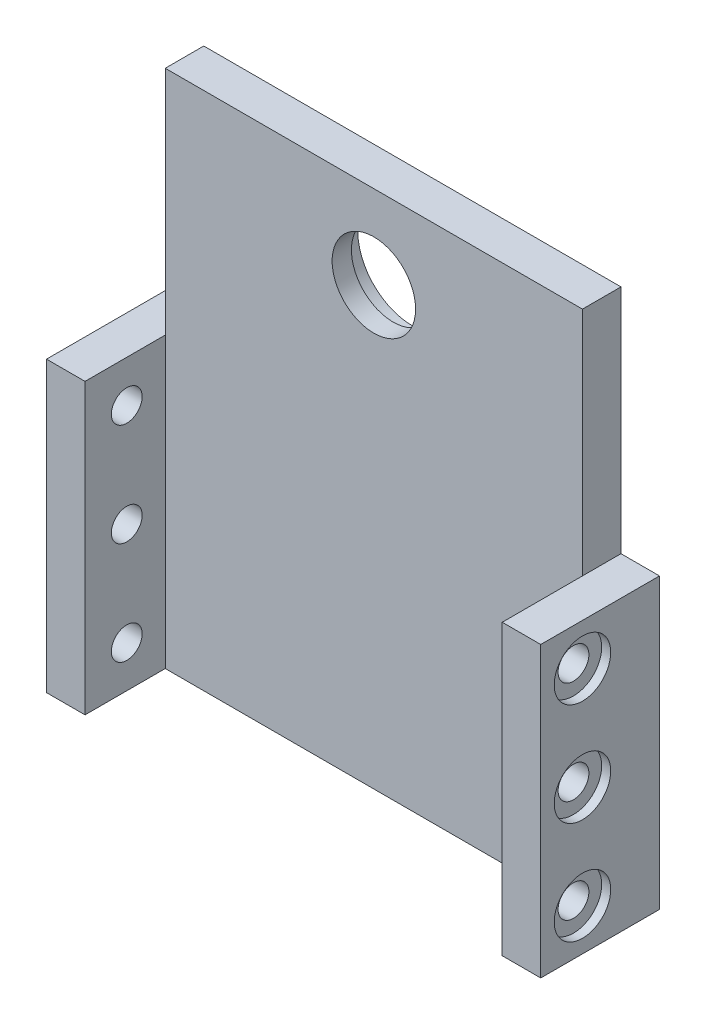
ISO-10303-21;
HEADER;
FILE_DESCRIPTION(('STEP AP214'),'2;1');
FILE_NAME('part.step','',(''),(''),'','','');
FILE_SCHEMA(('AUTOMOTIVE_DESIGN { 1 0 10303 214 1 1 1 1 }'));
ENDSEC;
DATA;
#1=APPLICATION_CONTEXT('core data for automotive mechanical design processes');
#2=APPLICATION_PROTOCOL_DEFINITION('international standard','automotive_design',2000,#1);
#3=PRODUCT_CONTEXT('',#1,'mechanical');
#4=PRODUCT('Part','Part','',(#3));
#5=PRODUCT_RELATED_PRODUCT_CATEGORY('part','',(#4));
#6=PRODUCT_DEFINITION_FORMATION('','',#4);
#7=PRODUCT_DEFINITION_CONTEXT('part definition',#1,'design');
#8=PRODUCT_DEFINITION('design','',#6,#7);
#9=PRODUCT_DEFINITION_SHAPE('','',#8);
#10=(LENGTH_UNIT() NAMED_UNIT(*) SI_UNIT(.MILLI.,.METRE.));
#11=(NAMED_UNIT(*) PLANE_ANGLE_UNIT() SI_UNIT($,.RADIAN.));
#12=(NAMED_UNIT(*) SI_UNIT($,.STERADIAN.) SOLID_ANGLE_UNIT());
#13=UNCERTAINTY_MEASURE_WITH_UNIT(LENGTH_MEASURE(1.E-05),#10,'distance_accuracy_value','');
#14=(GEOMETRIC_REPRESENTATION_CONTEXT(3) GLOBAL_UNCERTAINTY_ASSIGNED_CONTEXT((#13)) GLOBAL_UNIT_ASSIGNED_CONTEXT((#10,
#11,#12)) REPRESENTATION_CONTEXT('',''));
#15=CARTESIAN_POINT('',(0.,0.,0.));
#16=DIRECTION('',(0.,0.,1.));
#17=DIRECTION('',(1.,0.,0.));
#18=AXIS2_PLACEMENT_3D('',#15,#16,#17);
#19=CARTESIAN_POINT('',(16.25,-11.25,-3.));
#20=DIRECTION('',(1.,0.,0.));
#21=DIRECTION('',(0.,0.,-1.));
#22=AXIS2_PLACEMENT_3D('',#19,#20,#21);
#23=PLANE('',#22);
#24=DIRECTION('',(0.,1.,0.));
#25=VECTOR('',#24,1.);
#26=CARTESIAN_POINT('',(16.25,-11.25,0.));
#27=LINE('',#26,#25);
#28=CARTESIAN_POINT('',(16.25,11.25,0.));
#29=VERTEX_POINT('',#28);
#30=CARTESIAN_POINT('',(16.25,29.25,0.));
#31=VERTEX_POINT('',#30);
#32=EDGE_CURVE('E184',#29,#31,#27,.T.);
#33=ORIENTED_EDGE('',*,*,#32,.F.);
#34=DIRECTION('',(0.,0.,-1.));
#35=VECTOR('',#34,1.);
#36=CARTESIAN_POINT('',(16.25,11.25,-3.));
#37=LINE('',#36,#35);
#38=CARTESIAN_POINT('',(16.25,11.25,-3.));
#39=VERTEX_POINT('',#38);
#40=EDGE_CURVE('E12',#29,#39,#37,.T.);
#41=ORIENTED_EDGE('',*,*,#40,.T.);
#42=DIRECTION('',(0.,1.,0.));
#43=VECTOR('',#42,1.);
#44=CARTESIAN_POINT('',(16.25,-11.25,-3.));
#45=LINE('',#44,#43);
#46=CARTESIAN_POINT('',(16.25,29.25,-3.));
#47=VERTEX_POINT('',#46);
#48=EDGE_CURVE('E128',#39,#47,#45,.T.);
#49=ORIENTED_EDGE('',*,*,#48,.T.);
#50=DIRECTION('',(0.,0.,1.));
#51=VECTOR('',#50,1.);
#52=CARTESIAN_POINT('',(16.25,29.25,-3.));
#53=LINE('',#52,#51);
#54=EDGE_CURVE('E194',#47,#31,#53,.T.);
#55=ORIENTED_EDGE('',*,*,#54,.T.);
#56=EDGE_LOOP('',(#33,#41,#49,#55));
#57=FACE_BOUND('',#56,.T.);
#58=ADVANCED_FACE('F39',(#57),#23,.T.);
#59=CARTESIAN_POINT('',(16.25,-11.25,-3.));
#60=DIRECTION('',(0.,-1.,0.));
#61=DIRECTION('',(1.,0.,0.));
#62=AXIS2_PLACEMENT_3D('',#59,#60,#61);
#63=PLANE('',#62);
#64=DIRECTION('',(1.,0.,0.));
#65=VECTOR('',#64,1.);
#66=CARTESIAN_POINT('',(16.25,-11.25,0.));
#67=LINE('',#66,#65);
#68=CARTESIAN_POINT('',(-16.25,-11.25,0.));
#69=VERTEX_POINT('',#68);
#70=CARTESIAN_POINT('',(16.25,-11.25,0.));
#71=VERTEX_POINT('',#70);
#72=EDGE_CURVE('E187',#69,#71,#67,.T.);
#73=ORIENTED_EDGE('',*,*,#72,.F.);
#74=DIRECTION('',(0.,0.,1.));
#75=VECTOR('',#74,1.);
#76=CARTESIAN_POINT('',(-16.25,-11.25,-3.));
#77=LINE('',#76,#75);
#78=CARTESIAN_POINT('',(-16.25,-11.25,6.25000000000003));
#79=VERTEX_POINT('',#78);
#80=EDGE_CURVE('E129',#69,#79,#77,.T.);
#81=ORIENTED_EDGE('',*,*,#80,.T.);
#82=DIRECTION('',(1.,0.,0.));
#83=VECTOR('',#82,1.);
#84=CARTESIAN_POINT('',(-19.25,-11.25,6.25000000000003));
#85=LINE('',#84,#83);
#86=CARTESIAN_POINT('',(-19.25,-11.25,6.25000000000003));
#87=VERTEX_POINT('',#86);
#88=EDGE_CURVE('E181',#87,#79,#85,.T.);
#89=ORIENTED_EDGE('',*,*,#88,.F.);
#90=DIRECTION('',(0.,0.,1.));
#91=VECTOR('',#90,1.);
#92=CARTESIAN_POINT('',(-19.25,-11.25,-3.));
#93=LINE('',#92,#91);
#94=CARTESIAN_POINT('',(-19.25,-11.25,-3.));
#95=VERTEX_POINT('',#94);
#96=EDGE_CURVE('E163',#95,#87,#93,.T.);
#97=ORIENTED_EDGE('',*,*,#96,.F.);
#98=DIRECTION('',(1.,0.,0.));
#99=VECTOR('',#98,1.);
#100=CARTESIAN_POINT('',(16.25,-11.25,-3.));
#101=LINE('',#100,#99);
#102=CARTESIAN_POINT('',(19.25,-11.25,-3.));
#103=VERTEX_POINT('',#102);
#104=EDGE_CURVE('E192',#95,#103,#101,.T.);
#105=ORIENTED_EDGE('',*,*,#104,.T.);
#106=DIRECTION('',(0.,0.,1.));
#107=VECTOR('',#106,1.);
#108=CARTESIAN_POINT('',(19.25,-11.25,-3.));
#109=LINE('',#108,#107);
#110=CARTESIAN_POINT('',(19.25,-11.25,6.25000000000003));
#111=VERTEX_POINT('',#110);
#112=EDGE_CURVE('E139',#103,#111,#109,.T.);
#113=ORIENTED_EDGE('',*,*,#112,.T.);
#114=DIRECTION('',(-1.,0.,0.));
#115=VECTOR('',#114,1.);
#116=CARTESIAN_POINT('',(19.25,-11.25,6.25000000000003));
#117=LINE('',#116,#115);
#118=CARTESIAN_POINT('',(16.25,-11.25,6.25000000000003));
#119=VERTEX_POINT('',#118);
#120=EDGE_CURVE('E149',#111,#119,#117,.T.);
#121=ORIENTED_EDGE('',*,*,#120,.T.);
#122=DIRECTION('',(0.,0.,1.));
#123=VECTOR('',#122,1.);
#124=CARTESIAN_POINT('',(16.25,-11.25,-3.));
#125=LINE('',#124,#123);
#126=EDGE_CURVE('E140',#71,#119,#125,.T.);
#127=ORIENTED_EDGE('',*,*,#126,.F.);
#128=EDGE_LOOP('',(#73,#81,#89,#97,#105,#113,#121,#127));
#129=FACE_BOUND('',#128,.T.);
#130=ADVANCED_FACE('F222',(#129),#63,.T.);
#131=CARTESIAN_POINT('',(-16.25,-11.25,-3.));
#132=DIRECTION('',(-1.,0.,0.));
#133=DIRECTION('',(0.,0.,1.));
#134=AXIS2_PLACEMENT_3D('',#131,#132,#133);
#135=PLANE('',#134);
#136=DIRECTION('',(0.,0.,-1.));
#137=VECTOR('',#136,1.);
#138=CARTESIAN_POINT('',(-16.25,11.25,-3.));
#139=LINE('',#138,#137);
#140=CARTESIAN_POINT('',(-16.25,11.25,0.));
#141=VERTEX_POINT('',#140);
#142=CARTESIAN_POINT('',(-16.25,11.25,-3.));
#143=VERTEX_POINT('',#142);
#144=EDGE_CURVE('E47',#141,#143,#139,.T.);
#145=ORIENTED_EDGE('',*,*,#144,.F.);
#146=DIRECTION('',(0.,-1.,0.));
#147=VECTOR('',#146,1.);
#148=CARTESIAN_POINT('',(-16.25,-11.25,0.));
#149=LINE('',#148,#147);
#150=CARTESIAN_POINT('',(-16.25,29.25,0.));
#151=VERTEX_POINT('',#150);
#152=EDGE_CURVE('E202',#151,#141,#149,.T.);
#153=ORIENTED_EDGE('',*,*,#152,.F.);
#154=DIRECTION('',(0.,0.,1.));
#155=VECTOR('',#154,1.);
#156=CARTESIAN_POINT('',(-16.25,29.25,-3.));
#157=LINE('',#156,#155);
#158=CARTESIAN_POINT('',(-16.25,29.25,-3.));
#159=VERTEX_POINT('',#158);
#160=EDGE_CURVE('E206',#159,#151,#157,.T.);
#161=ORIENTED_EDGE('',*,*,#160,.F.);
#162=DIRECTION('',(0.,-1.,0.));
#163=VECTOR('',#162,1.);
#164=CARTESIAN_POINT('',(-16.25,-11.25,-3.));
#165=LINE('',#164,#163);
#166=EDGE_CURVE('E190',#159,#143,#165,.T.);
#167=ORIENTED_EDGE('',*,*,#166,.T.);
#168=EDGE_LOOP('',(#145,#153,#161,#167));
#169=FACE_BOUND('',#168,.T.);
#170=ADVANCED_FACE('F242',(#169),#135,.T.);
#171=CARTESIAN_POINT('',(16.25,29.25,-3.));
#172=DIRECTION('',(0.,1.,0.));
#173=DIRECTION('',(-1.,0.,0.));
#174=AXIS2_PLACEMENT_3D('',#171,#172,#173);
#175=PLANE('',#174);
#176=DIRECTION('',(-1.,0.,0.));
#177=VECTOR('',#176,1.);
#178=CARTESIAN_POINT('',(16.25,29.25,0.));
#179=LINE('',#178,#177);
#180=EDGE_CURVE('E198',#31,#151,#179,.T.);
#181=ORIENTED_EDGE('',*,*,#180,.F.);
#182=ORIENTED_EDGE('',*,*,#54,.F.);
#183=DIRECTION('',(-1.,0.,0.));
#184=VECTOR('',#183,1.);
#185=CARTESIAN_POINT('',(16.25,29.25,-3.));
#186=LINE('',#185,#184);
#187=EDGE_CURVE('E186',#47,#159,#186,.T.);
#188=ORIENTED_EDGE('',*,*,#187,.T.);
#189=ORIENTED_EDGE('',*,*,#160,.T.);
#190=EDGE_LOOP('',(#181,#182,#188,#189));
#191=FACE_BOUND('',#190,.T.);
#192=ADVANCED_FACE('F213',(#191),#175,.T.);
#193=CARTESIAN_POINT('',(0.,0.,-3.));
#194=DIRECTION('',(0.,0.,1.));
#195=DIRECTION('',(1.,0.,0.));
#196=AXIS2_PLACEMENT_3D('',#193,#194,#195);
#197=PLANE('',#196);
#198=CARTESIAN_POINT('',(0.,22.75,-3.));
#199=DIRECTION('',(0.,0.,-1.));
#200=DIRECTION('',(-1.,0.,0.));
#201=AXIS2_PLACEMENT_3D('',#198,#199,#200);
#202=CIRCLE('',#201,4.25);
#203=CARTESIAN_POINT('',(-4.25,22.75,-3.));
#204=VERTEX_POINT('',#203);
#205=EDGE_CURVE('E323',#204,#204,#202,.T.);
#206=ORIENTED_EDGE('',*,*,#205,.F.);
#207=EDGE_LOOP('',(#206));
#208=FACE_BOUND('',#207,.T.);
#209=ORIENTED_EDGE('',*,*,#48,.F.);
#210=DIRECTION('',(-1.,0.,0.));
#211=VECTOR('',#210,1.);
#212=CARTESIAN_POINT('',(19.25,11.25,-3.));
#213=LINE('',#212,#211);
#214=CARTESIAN_POINT('',(19.25,11.25,-3.));
#215=VERTEX_POINT('',#214);
#216=EDGE_CURVE('E56',#215,#39,#213,.T.);
#217=ORIENTED_EDGE('',*,*,#216,.F.);
#218=DIRECTION('',(0.,-1.,0.));
#219=VECTOR('',#218,1.);
#220=CARTESIAN_POINT('',(19.25,-11.25,-3.));
#221=LINE('',#220,#219);
#222=EDGE_CURVE('E125',#215,#103,#221,.T.);
#223=ORIENTED_EDGE('',*,*,#222,.T.);
#224=ORIENTED_EDGE('',*,*,#104,.F.);
#225=DIRECTION('',(0.,-1.,0.));
#226=VECTOR('',#225,1.);
#227=CARTESIAN_POINT('',(-19.25,-11.25,-3.));
#228=LINE('',#227,#226);
#229=CARTESIAN_POINT('',(-19.25,11.25,-3.));
#230=VERTEX_POINT('',#229);
#231=EDGE_CURVE('E160',#230,#95,#228,.T.);
#232=ORIENTED_EDGE('',*,*,#231,.F.);
#233=DIRECTION('',(1.,0.,0.));
#234=VECTOR('',#233,1.);
#235=CARTESIAN_POINT('',(-19.25,11.25,-3.));
#236=LINE('',#235,#234);
#237=EDGE_CURVE('E170',#230,#143,#236,.T.);
#238=ORIENTED_EDGE('',*,*,#237,.T.);
#239=ORIENTED_EDGE('',*,*,#166,.F.);
#240=ORIENTED_EDGE('',*,*,#187,.F.);
#241=EDGE_LOOP('',(#209,#217,#223,#224,#232,#238,#239,#240));
#242=FACE_BOUND('',#241,.T.);
#243=ADVANCED_FACE('F124',(#208,#242),#197,.F.);
#244=CARTESIAN_POINT('',(0.,0.,0.));
#245=DIRECTION('',(0.,0.,1.));
#246=DIRECTION('',(1.,0.,0.));
#247=AXIS2_PLACEMENT_3D('',#244,#245,#246);
#248=PLANE('',#247);
#249=CARTESIAN_POINT('',(0.,22.75,0.));
#250=DIRECTION('',(0.,0.,1.));
#251=DIRECTION('',(1.,0.,0.));
#252=AXIS2_PLACEMENT_3D('',#249,#250,#251);
#253=CIRCLE('',#252,3.24999999999997);
#254=CARTESIAN_POINT('',(3.24999999999997,22.75,0.));
#255=VERTEX_POINT('',#254);
#256=EDGE_CURVE('E320',#255,#255,#253,.T.);
#257=ORIENTED_EDGE('',*,*,#256,.F.);
#258=EDGE_LOOP('',(#257));
#259=FACE_BOUND('',#258,.T.);
#260=EDGE_CURVE('E195',#71,#29,#27,.T.);
#261=ORIENTED_EDGE('',*,*,#260,.T.);
#262=ORIENTED_EDGE('',*,*,#32,.T.);
#263=ORIENTED_EDGE('',*,*,#180,.T.);
#264=ORIENTED_EDGE('',*,*,#152,.T.);
#265=EDGE_CURVE('E201',#141,#69,#149,.T.);
#266=ORIENTED_EDGE('',*,*,#265,.T.);
#267=ORIENTED_EDGE('',*,*,#72,.T.);
#268=EDGE_LOOP('',(#261,#262,#263,#264,#266,#267));
#269=FACE_BOUND('',#268,.T.);
#270=ADVANCED_FACE('F215',(#259,#269),#248,.T.);
#271=CARTESIAN_POINT('',(-16.25,0.,0.));
#272=DIRECTION('',(1.,0.,0.));
#273=DIRECTION('',(0.,0.,-1.));
#274=AXIS2_PLACEMENT_3D('',#271,#272,#273);
#275=PLANE('',#274);
#276=CARTESIAN_POINT('',(-16.25,8.,3.00000000000002));
#277=DIRECTION('',(1.,0.,0.));
#278=DIRECTION('',(0.,0.,-1.));
#279=AXIS2_PLACEMENT_3D('',#276,#277,#278);
#280=CIRCLE('',#279,1.2);
#281=CARTESIAN_POINT('',(-16.25,8.,1.80000000000002));
#282=VERTEX_POINT('',#281);
#283=EDGE_CURVE('E463',#282,#282,#280,.T.);
#284=ORIENTED_EDGE('',*,*,#283,.F.);
#285=EDGE_LOOP('',(#284));
#286=FACE_BOUND('',#285,.T.);
#287=CARTESIAN_POINT('',(-16.25,0.,3.00000000000002));
#288=DIRECTION('',(1.,0.,0.));
#289=DIRECTION('',(0.,0.,-1.));
#290=AXIS2_PLACEMENT_3D('',#287,#288,#289);
#291=CIRCLE('',#290,1.2);
#292=CARTESIAN_POINT('',(-16.25,0.,1.80000000000002));
#293=VERTEX_POINT('',#292);
#294=EDGE_CURVE('E305',#293,#293,#291,.T.);
#295=ORIENTED_EDGE('',*,*,#294,.F.);
#296=EDGE_LOOP('',(#295));
#297=FACE_BOUND('',#296,.T.);
#298=CARTESIAN_POINT('',(-16.25,-8.,3.00000000000001));
#299=DIRECTION('',(1.,0.,0.));
#300=DIRECTION('',(0.,0.,-1.));
#301=AXIS2_PLACEMENT_3D('',#298,#299,#300);
#302=CIRCLE('',#301,1.2);
#303=CARTESIAN_POINT('',(-16.25,-8.,1.80000000000001));
#304=VERTEX_POINT('',#303);
#305=EDGE_CURVE('E317',#304,#304,#302,.T.);
#306=ORIENTED_EDGE('',*,*,#305,.F.);
#307=EDGE_LOOP('',(#306));
#308=FACE_BOUND('',#307,.T.);
#309=ORIENTED_EDGE('',*,*,#265,.F.);
#310=CARTESIAN_POINT('',(-16.25,11.25,6.25000000000003));
#311=VERTEX_POINT('',#310);
#312=EDGE_CURVE('E164',#311,#141,#139,.T.);
#313=ORIENTED_EDGE('',*,*,#312,.F.);
#314=DIRECTION('',(0.,1.,0.));
#315=VECTOR('',#314,1.);
#316=CARTESIAN_POINT('',(-16.25,-11.25,6.25000000000003));
#317=LINE('',#316,#315);
#318=EDGE_CURVE('E172',#79,#311,#317,.T.);
#319=ORIENTED_EDGE('',*,*,#318,.F.);
#320=ORIENTED_EDGE('',*,*,#80,.F.);
#321=EDGE_LOOP('',(#309,#313,#319,#320));
#322=FACE_BOUND('',#321,.T.);
#323=ADVANCED_FACE('F258',(#286,#297,#308,#322),#275,.T.);
#324=CARTESIAN_POINT('',(-19.25,-11.25,6.25000000000003));
#325=DIRECTION('',(0.,0.,-1.));
#326=DIRECTION('',(-1.,0.,0.));
#327=AXIS2_PLACEMENT_3D('',#324,#325,#326);
#328=PLANE('',#327);
#329=ORIENTED_EDGE('',*,*,#318,.T.);
#330=DIRECTION('',(1.,0.,0.));
#331=VECTOR('',#330,1.);
#332=CARTESIAN_POINT('',(-19.25,11.25,6.25000000000003));
#333=LINE('',#332,#331);
#334=CARTESIAN_POINT('',(-19.25,11.25,6.25000000000003));
#335=VERTEX_POINT('',#334);
#336=EDGE_CURVE('E178',#335,#311,#333,.T.);
#337=ORIENTED_EDGE('',*,*,#336,.F.);
#338=DIRECTION('',(0.,1.,0.));
#339=VECTOR('',#338,1.);
#340=CARTESIAN_POINT('',(-19.25,-11.25,6.25000000000003));
#341=LINE('',#340,#339);
#342=EDGE_CURVE('E166',#87,#335,#341,.T.);
#343=ORIENTED_EDGE('',*,*,#342,.F.);
#344=ORIENTED_EDGE('',*,*,#88,.T.);
#345=EDGE_LOOP('',(#329,#337,#343,#344));
#346=FACE_BOUND('',#345,.T.);
#347=ADVANCED_FACE('F262',(#346),#328,.F.);
#348=CARTESIAN_POINT('',(-19.25,11.25,-3.));
#349=DIRECTION('',(0.,-1.,0.));
#350=DIRECTION('',(0.,0.,-1.));
#351=AXIS2_PLACEMENT_3D('',#348,#349,#350);
#352=PLANE('',#351);
#353=ORIENTED_EDGE('',*,*,#312,.T.);
#354=ORIENTED_EDGE('',*,*,#144,.T.);
#355=ORIENTED_EDGE('',*,*,#237,.F.);
#356=DIRECTION('',(0.,0.,-1.));
#357=VECTOR('',#356,1.);
#358=CARTESIAN_POINT('',(-19.25,11.25,-3.));
#359=LINE('',#358,#357);
#360=EDGE_CURVE('E168',#335,#230,#359,.T.);
#361=ORIENTED_EDGE('',*,*,#360,.F.);
#362=ORIENTED_EDGE('',*,*,#336,.T.);
#363=EDGE_LOOP('',(#353,#354,#355,#361,#362));
#364=FACE_BOUND('',#363,.T.);
#365=ADVANCED_FACE('F265',(#364),#352,.F.);
#366=CARTESIAN_POINT('',(-19.25,0.,0.));
#367=DIRECTION('',(1.,0.,0.));
#368=DIRECTION('',(0.,0.,-1.));
#369=AXIS2_PLACEMENT_3D('',#366,#367,#368);
#370=PLANE('',#369);
#371=CARTESIAN_POINT('',(-19.25,8.,3.00000000000002));
#372=DIRECTION('',(-1.,0.,0.));
#373=DIRECTION('',(0.,0.,1.));
#374=AXIS2_PLACEMENT_3D('',#371,#372,#373);
#375=CIRCLE('',#374,2.19999999999999);
#376=CARTESIAN_POINT('',(-19.25,8.,5.20000000000002));
#377=VERTEX_POINT('',#376);
#378=EDGE_CURVE('E283',#377,#377,#375,.T.);
#379=ORIENTED_EDGE('',*,*,#378,.F.);
#380=EDGE_LOOP('',(#379));
#381=FACE_BOUND('',#380,.T.);
#382=CARTESIAN_POINT('',(-19.25,0.,3.00000000000002));
#383=DIRECTION('',(-1.,0.,0.));
#384=DIRECTION('',(0.,0.,1.));
#385=AXIS2_PLACEMENT_3D('',#382,#383,#384);
#386=CIRCLE('',#385,2.19999999999999);
#387=CARTESIAN_POINT('',(-19.25,0.,5.20000000000001));
#388=VERTEX_POINT('',#387);
#389=EDGE_CURVE('E287',#388,#388,#386,.T.);
#390=ORIENTED_EDGE('',*,*,#389,.F.);
#391=EDGE_LOOP('',(#390));
#392=FACE_BOUND('',#391,.T.);
#393=CARTESIAN_POINT('',(-19.25,-8.,3.00000000000001));
#394=DIRECTION('',(-1.,0.,0.));
#395=DIRECTION('',(0.,0.,1.));
#396=AXIS2_PLACEMENT_3D('',#393,#394,#395);
#397=CIRCLE('',#396,2.19999999999999);
#398=CARTESIAN_POINT('',(-19.25,-8.,5.20000000000001));
#399=VERTEX_POINT('',#398);
#400=EDGE_CURVE('E291',#399,#399,#397,.T.);
#401=ORIENTED_EDGE('',*,*,#400,.F.);
#402=EDGE_LOOP('',(#401));
#403=FACE_BOUND('',#402,.T.);
#404=ORIENTED_EDGE('',*,*,#231,.T.);
#405=ORIENTED_EDGE('',*,*,#96,.T.);
#406=ORIENTED_EDGE('',*,*,#342,.T.);
#407=ORIENTED_EDGE('',*,*,#360,.T.);
#408=EDGE_LOOP('',(#404,#405,#406,#407));
#409=FACE_BOUND('',#408,.T.);
#410=ADVANCED_FACE('F269',(#381,#392,#403,#409),#370,.F.);
#411=CARTESIAN_POINT('',(16.25,0.,0.));
#412=DIRECTION('',(-1.,0.,0.));
#413=DIRECTION('',(0.,0.,-1.));
#414=AXIS2_PLACEMENT_3D('',#411,#412,#413);
#415=PLANE('',#414);
#416=CARTESIAN_POINT('',(16.25,8.,3.00000000000002));
#417=DIRECTION('',(-1.,0.,0.));
#418=DIRECTION('',(0.,0.,1.));
#419=AXIS2_PLACEMENT_3D('',#416,#417,#418);
#420=CIRCLE('',#419,1.2);
#421=CARTESIAN_POINT('',(16.25,8.,4.20000000000002));
#422=VERTEX_POINT('',#421);
#423=EDGE_CURVE('E429',#422,#422,#420,.T.);
#424=ORIENTED_EDGE('',*,*,#423,.F.);
#425=EDGE_LOOP('',(#424));
#426=FACE_BOUND('',#425,.T.);
#427=CARTESIAN_POINT('',(16.25,0.,3.00000000000002));
#428=DIRECTION('',(-1.,0.,0.));
#429=DIRECTION('',(0.,0.,1.));
#430=AXIS2_PLACEMENT_3D('',#427,#428,#429);
#431=CIRCLE('',#430,1.2);
#432=CARTESIAN_POINT('',(16.25,0.,4.20000000000002));
#433=VERTEX_POINT('',#432);
#434=EDGE_CURVE('E441',#433,#433,#431,.T.);
#435=ORIENTED_EDGE('',*,*,#434,.F.);
#436=EDGE_LOOP('',(#435));
#437=FACE_BOUND('',#436,.T.);
#438=CARTESIAN_POINT('',(16.25,-8.,3.00000000000001));
#439=DIRECTION('',(-1.,0.,0.));
#440=DIRECTION('',(0.,0.,1.));
#441=AXIS2_PLACEMENT_3D('',#438,#439,#440);
#442=CIRCLE('',#441,1.2);
#443=CARTESIAN_POINT('',(16.25,-8.,4.20000000000001));
#444=VERTEX_POINT('',#443);
#445=EDGE_CURVE('E453',#444,#444,#442,.T.);
#446=ORIENTED_EDGE('',*,*,#445,.F.);
#447=EDGE_LOOP('',(#446));
#448=FACE_BOUND('',#447,.T.);
#449=ORIENTED_EDGE('',*,*,#260,.F.);
#450=ORIENTED_EDGE('',*,*,#126,.T.);
#451=DIRECTION('',(0.,1.,0.));
#452=VECTOR('',#451,1.);
#453=CARTESIAN_POINT('',(16.25,-11.25,6.25000000000003));
#454=LINE('',#453,#452);
#455=CARTESIAN_POINT('',(16.25,11.25,6.25000000000003));
#456=VERTEX_POINT('',#455);
#457=EDGE_CURVE('E152',#119,#456,#454,.T.);
#458=ORIENTED_EDGE('',*,*,#457,.T.);
#459=EDGE_CURVE('E49',#456,#29,#37,.T.);
#460=ORIENTED_EDGE('',*,*,#459,.T.);
#461=EDGE_LOOP('',(#449,#450,#458,#460));
#462=FACE_BOUND('',#461,.T.);
#463=ADVANCED_FACE('F220',(#426,#437,#448,#462),#415,.T.);
#464=CARTESIAN_POINT('',(19.25,11.25,-3.));
#465=DIRECTION('',(0.,1.,0.));
#466=DIRECTION('',(0.,0.,1.));
#467=AXIS2_PLACEMENT_3D('',#464,#465,#466);
#468=PLANE('',#467);
#469=ORIENTED_EDGE('',*,*,#459,.F.);
#470=DIRECTION('',(-1.,0.,0.));
#471=VECTOR('',#470,1.);
#472=CARTESIAN_POINT('',(19.25,11.25,6.25000000000003));
#473=LINE('',#472,#471);
#474=CARTESIAN_POINT('',(19.25,11.25,6.25000000000003));
#475=VERTEX_POINT('',#474);
#476=EDGE_CURVE('E130',#475,#456,#473,.T.);
#477=ORIENTED_EDGE('',*,*,#476,.F.);
#478=DIRECTION('',(0.,0.,-1.));
#479=VECTOR('',#478,1.);
#480=CARTESIAN_POINT('',(19.25,11.25,-3.));
#481=LINE('',#480,#479);
#482=EDGE_CURVE('E136',#475,#215,#481,.T.);
#483=ORIENTED_EDGE('',*,*,#482,.T.);
#484=ORIENTED_EDGE('',*,*,#216,.T.);
#485=ORIENTED_EDGE('',*,*,#40,.F.);
#486=EDGE_LOOP('',(#469,#477,#483,#484,#485));
#487=FACE_BOUND('',#486,.T.);
#488=ADVANCED_FACE('F143',(#487),#468,.T.);
#489=CARTESIAN_POINT('',(19.25,-11.25,6.25000000000003));
#490=DIRECTION('',(0.,0.,1.));
#491=DIRECTION('',(1.,0.,0.));
#492=AXIS2_PLACEMENT_3D('',#489,#490,#491);
#493=PLANE('',#492);
#494=ORIENTED_EDGE('',*,*,#457,.F.);
#495=ORIENTED_EDGE('',*,*,#120,.F.);
#496=DIRECTION('',(0.,1.,0.));
#497=VECTOR('',#496,1.);
#498=CARTESIAN_POINT('',(19.25,-11.25,6.25000000000003));
#499=LINE('',#498,#497);
#500=EDGE_CURVE('E144',#111,#475,#499,.T.);
#501=ORIENTED_EDGE('',*,*,#500,.T.);
#502=ORIENTED_EDGE('',*,*,#476,.T.);
#503=EDGE_LOOP('',(#494,#495,#501,#502));
#504=FACE_BOUND('',#503,.T.);
#505=ADVANCED_FACE('F226',(#504),#493,.T.);
#506=CARTESIAN_POINT('',(19.25,0.,0.));
#507=DIRECTION('',(-1.,0.,0.));
#508=DIRECTION('',(0.,0.,-1.));
#509=AXIS2_PLACEMENT_3D('',#506,#507,#508);
#510=PLANE('',#509);
#511=CARTESIAN_POINT('',(19.25,8.,3.00000000000002));
#512=DIRECTION('',(1.,0.,0.));
#513=DIRECTION('',(0.,0.,-1.));
#514=AXIS2_PLACEMENT_3D('',#511,#512,#513);
#515=CIRCLE('',#514,2.19999999999999);
#516=CARTESIAN_POINT('',(19.25,8.,0.80000000000003));
#517=VERTEX_POINT('',#516);
#518=EDGE_CURVE('E422',#517,#517,#515,.T.);
#519=ORIENTED_EDGE('',*,*,#518,.F.);
#520=EDGE_LOOP('',(#519));
#521=FACE_BOUND('',#520,.T.);
#522=CARTESIAN_POINT('',(19.25,0.,3.00000000000002));
#523=DIRECTION('',(1.,0.,0.));
#524=DIRECTION('',(0.,0.,-1.));
#525=AXIS2_PLACEMENT_3D('',#522,#523,#524);
#526=CIRCLE('',#525,2.19999999999999);
#527=CARTESIAN_POINT('',(19.25,0.,0.800000000000023));
#528=VERTEX_POINT('',#527);
#529=EDGE_CURVE('E432',#528,#528,#526,.T.);
#530=ORIENTED_EDGE('',*,*,#529,.F.);
#531=EDGE_LOOP('',(#530));
#532=FACE_BOUND('',#531,.T.);
#533=CARTESIAN_POINT('',(19.25,-8.,3.00000000000001));
#534=DIRECTION('',(1.,0.,0.));
#535=DIRECTION('',(0.,0.,-1.));
#536=AXIS2_PLACEMENT_3D('',#533,#534,#535);
#537=CIRCLE('',#536,2.19999999999999);
#538=CARTESIAN_POINT('',(19.25,-8.,0.800000000000019));
#539=VERTEX_POINT('',#538);
#540=EDGE_CURVE('E444',#539,#539,#537,.T.);
#541=ORIENTED_EDGE('',*,*,#540,.F.);
#542=EDGE_LOOP('',(#541));
#543=FACE_BOUND('',#542,.T.);
#544=ORIENTED_EDGE('',*,*,#222,.F.);
#545=ORIENTED_EDGE('',*,*,#482,.F.);
#546=ORIENTED_EDGE('',*,*,#500,.F.);
#547=ORIENTED_EDGE('',*,*,#112,.F.);
#548=EDGE_LOOP('',(#544,#545,#546,#547));
#549=FACE_BOUND('',#548,.T.);
#550=ADVANCED_FACE('F134',(#521,#532,#543,#549),#510,.F.);
#551=CARTESIAN_POINT('',(0.,0.,-1.5));
#552=DIRECTION('',(0.,0.,1.));
#553=DIRECTION('',(1.,0.,0.));
#554=AXIS2_PLACEMENT_3D('',#551,#552,#553);
#555=PLANE('',#554);
#556=CARTESIAN_POINT('',(0.,22.75,-1.5));
#557=DIRECTION('',(0.,0.,1.));
#558=DIRECTION('',(1.,0.,0.));
#559=AXIS2_PLACEMENT_3D('',#556,#557,#558);
#560=CIRCLE('',#559,3.24999999999997);
#561=CARTESIAN_POINT('',(3.24999999999997,22.75,-1.5));
#562=VERTEX_POINT('',#561);
#563=EDGE_CURVE('E42',#562,#562,#560,.T.);
#564=ORIENTED_EDGE('',*,*,#563,.T.);
#565=EDGE_LOOP('',(#564));
#566=FACE_BOUND('',#565,.T.);
#567=CARTESIAN_POINT('',(0.,22.75,-1.5));
#568=DIRECTION('',(0.,0.,1.));
#569=DIRECTION('',(1.,0.,0.));
#570=AXIS2_PLACEMENT_3D('',#567,#568,#569);
#571=CIRCLE('',#570,4.25);
#572=CARTESIAN_POINT('',(4.25,22.75,-1.5));
#573=VERTEX_POINT('',#572);
#574=EDGE_CURVE('E153',#573,#573,#571,.F.);
#575=ORIENTED_EDGE('',*,*,#574,.T.);
#576=EDGE_LOOP('',(#575));
#577=FACE_BOUND('',#576,.T.);
#578=ADVANCED_FACE('F233',(#566,#577),#555,.F.);
#579=CARTESIAN_POINT('',(0.,22.75,12.0208152801713));
#580=DIRECTION('',(0.,0.,-1.));
#581=DIRECTION('',(-1.,0.,0.));
#582=AXIS2_PLACEMENT_3D('',#579,#580,#581);
#583=CYLINDRICAL_SURFACE('',#582,4.25);
#584=ORIENTED_EDGE('',*,*,#205,.T.);
#585=EDGE_LOOP('',(#584));
#586=FACE_BOUND('',#585,.T.);
#587=ORIENTED_EDGE('',*,*,#574,.F.);
#588=EDGE_LOOP('',(#587));
#589=FACE_BOUND('',#588,.T.);
#590=ADVANCED_FACE('F329',(#586,#589),#583,.F.);
#591=CARTESIAN_POINT('',(0.,22.75,6.25000000000003));
#592=DIRECTION('',(0.,0.,-1.));
#593=DIRECTION('',(-1.,0.,0.));
#594=AXIS2_PLACEMENT_3D('',#591,#592,#593);
#595=CYLINDRICAL_SURFACE('',#594,3.24999999999997);
#596=ORIENTED_EDGE('',*,*,#256,.T.);
#597=EDGE_LOOP('',(#596));
#598=FACE_BOUND('',#597,.T.);
#599=ORIENTED_EDGE('',*,*,#563,.F.);
#600=EDGE_LOOP('',(#599));
#601=FACE_BOUND('',#600,.T.);
#602=ADVANCED_FACE('F331',(#598,#601),#595,.F.);
#603=CARTESIAN_POINT('',(-19.25,-8.,3.00000000000001));
#604=DIRECTION('',(-1.,0.,0.));
#605=DIRECTION('',(0.,0.,1.));
#606=AXIS2_PLACEMENT_3D('',#603,#604,#605);
#607=CYLINDRICAL_SURFACE('',#606,1.2);
#608=CARTESIAN_POINT('',(-18.55,-8.,3.00000000000001));
#609=DIRECTION('',(-1.,0.,0.));
#610=DIRECTION('',(0.,0.,1.));
#611=AXIS2_PLACEMENT_3D('',#608,#609,#610);
#612=CIRCLE('',#611,1.2);
#613=CARTESIAN_POINT('',(-18.55,-8.,4.20000000000001));
#614=VERTEX_POINT('',#613);
#615=EDGE_CURVE('E308',#614,#614,#612,.T.);
#616=ORIENTED_EDGE('',*,*,#615,.T.);
#617=EDGE_LOOP('',(#616));
#618=FACE_BOUND('',#617,.T.);
#619=ORIENTED_EDGE('',*,*,#305,.T.);
#620=EDGE_LOOP('',(#619));
#621=FACE_BOUND('',#620,.T.);
#622=ADVANCED_FACE('F338',(#618,#621),#607,.F.);
#623=CARTESIAN_POINT('',(-18.55,-6.8,3.00000000000001));
#624=DIRECTION('',(1.,0.,0.));
#625=DIRECTION('',(0.,0.,-1.));
#626=AXIS2_PLACEMENT_3D('',#623,#624,#625);
#627=PLANE('',#626);
#628=ORIENTED_EDGE('',*,*,#615,.F.);
#629=EDGE_LOOP('',(#628));
#630=FACE_BOUND('',#629,.T.);
#631=CARTESIAN_POINT('',(-18.55,-8.,3.00000000000001));
#632=DIRECTION('',(-1.,0.,0.));
#633=DIRECTION('',(0.,0.,1.));
#634=AXIS2_PLACEMENT_3D('',#631,#632,#633);
#635=CIRCLE('',#634,2.2);
#636=CARTESIAN_POINT('',(-18.55,-8.,5.20000000000001));
#637=VERTEX_POINT('',#636);
#638=EDGE_CURVE('E304',#637,#637,#635,.T.);
#639=ORIENTED_EDGE('',*,*,#638,.T.);
#640=EDGE_LOOP('',(#639));
#641=FACE_BOUND('',#640,.T.);
#642=ADVANCED_FACE('F346',(#630,#641),#627,.F.);
#643=CARTESIAN_POINT('',(-19.25,-8.,3.00000000000001));
#644=DIRECTION('',(-1.,0.,0.));
#645=DIRECTION('',(0.,0.,1.));
#646=AXIS2_PLACEMENT_3D('',#643,#644,#645);
#647=CYLINDRICAL_SURFACE('',#646,2.2);
#648=ORIENTED_EDGE('',*,*,#638,.F.);
#649=EDGE_LOOP('',(#648));
#650=FACE_BOUND('',#649,.T.);
#651=ORIENTED_EDGE('',*,*,#400,.T.);
#652=EDGE_LOOP('',(#651));
#653=FACE_BOUND('',#652,.T.);
#654=ADVANCED_FACE('F350',(#650,#653),#647,.F.);
#655=CARTESIAN_POINT('',(-19.25,0.,3.00000000000002));
#656=DIRECTION('',(-1.,0.,0.));
#657=DIRECTION('',(0.,0.,1.));
#658=AXIS2_PLACEMENT_3D('',#655,#656,#657);
#659=CYLINDRICAL_SURFACE('',#658,1.2);
#660=CARTESIAN_POINT('',(-18.55,0.,3.00000000000002));
#661=DIRECTION('',(-1.,0.,0.));
#662=DIRECTION('',(0.,0.,1.));
#663=AXIS2_PLACEMENT_3D('',#660,#661,#662);
#664=CIRCLE('',#663,1.2);
#665=CARTESIAN_POINT('',(-18.55,0.,4.20000000000002));
#666=VERTEX_POINT('',#665);
#667=EDGE_CURVE('E311',#666,#666,#664,.T.);
#668=ORIENTED_EDGE('',*,*,#667,.T.);
#669=EDGE_LOOP('',(#668));
#670=FACE_BOUND('',#669,.T.);
#671=ORIENTED_EDGE('',*,*,#294,.T.);
#672=EDGE_LOOP('',(#671));
#673=FACE_BOUND('',#672,.T.);
#674=ADVANCED_FACE('F354',(#670,#673),#659,.F.);
#675=CARTESIAN_POINT('',(-18.55,1.2,3.00000000000002));
#676=DIRECTION('',(1.,0.,0.));
#677=DIRECTION('',(0.,0.,-1.));
#678=AXIS2_PLACEMENT_3D('',#675,#676,#677);
#679=PLANE('',#678);
#680=ORIENTED_EDGE('',*,*,#667,.F.);
#681=EDGE_LOOP('',(#680));
#682=FACE_BOUND('',#681,.T.);
#683=CARTESIAN_POINT('',(-18.55,0.,3.00000000000002));
#684=DIRECTION('',(-1.,0.,0.));
#685=DIRECTION('',(0.,0.,1.));
#686=AXIS2_PLACEMENT_3D('',#683,#684,#685);
#687=CIRCLE('',#686,2.2);
#688=CARTESIAN_POINT('',(-18.55,0.,5.20000000000002));
#689=VERTEX_POINT('',#688);
#690=EDGE_CURVE('E467',#689,#689,#687,.T.);
#691=ORIENTED_EDGE('',*,*,#690,.T.);
#692=EDGE_LOOP('',(#691));
#693=FACE_BOUND('',#692,.T.);
#694=ADVANCED_FACE('F358',(#682,#693),#679,.F.);
#695=CARTESIAN_POINT('',(-19.25,0.,3.00000000000002));
#696=DIRECTION('',(-1.,0.,0.));
#697=DIRECTION('',(0.,0.,1.));
#698=AXIS2_PLACEMENT_3D('',#695,#696,#697);
#699=CYLINDRICAL_SURFACE('',#698,2.2);
#700=ORIENTED_EDGE('',*,*,#690,.F.);
#701=EDGE_LOOP('',(#700));
#702=FACE_BOUND('',#701,.T.);
#703=ORIENTED_EDGE('',*,*,#389,.T.);
#704=EDGE_LOOP('',(#703));
#705=FACE_BOUND('',#704,.T.);
#706=ADVANCED_FACE('F362',(#702,#705),#699,.F.);
#707=CARTESIAN_POINT('',(-19.25,8.,3.00000000000002));
#708=DIRECTION('',(-1.,0.,0.));
#709=DIRECTION('',(0.,0.,1.));
#710=AXIS2_PLACEMENT_3D('',#707,#708,#709);
#711=CYLINDRICAL_SURFACE('',#710,1.2);
#712=CARTESIAN_POINT('',(-18.55,8.,3.00000000000002));
#713=DIRECTION('',(-1.,0.,0.));
#714=DIRECTION('',(0.,0.,1.));
#715=AXIS2_PLACEMENT_3D('',#712,#713,#714);
#716=CIRCLE('',#715,1.2);
#717=CARTESIAN_POINT('',(-18.55,8.,4.20000000000002));
#718=VERTEX_POINT('',#717);
#719=EDGE_CURVE('E460',#718,#718,#716,.T.);
#720=ORIENTED_EDGE('',*,*,#719,.T.);
#721=EDGE_LOOP('',(#720));
#722=FACE_BOUND('',#721,.T.);
#723=ORIENTED_EDGE('',*,*,#283,.T.);
#724=EDGE_LOOP('',(#723));
#725=FACE_BOUND('',#724,.T.);
#726=ADVANCED_FACE('F366',(#722,#725),#711,.F.);
#727=CARTESIAN_POINT('',(-18.55,9.2,3.00000000000002));
#728=DIRECTION('',(1.,0.,0.));
#729=DIRECTION('',(0.,0.,-1.));
#730=AXIS2_PLACEMENT_3D('',#727,#728,#729);
#731=PLANE('',#730);
#732=ORIENTED_EDGE('',*,*,#719,.F.);
#733=EDGE_LOOP('',(#732));
#734=FACE_BOUND('',#733,.T.);
#735=CARTESIAN_POINT('',(-18.55,8.,3.00000000000002));
#736=DIRECTION('',(-1.,0.,0.));
#737=DIRECTION('',(0.,0.,1.));
#738=AXIS2_PLACEMENT_3D('',#735,#736,#737);
#739=CIRCLE('',#738,2.2);
#740=CARTESIAN_POINT('',(-18.55,8.,5.20000000000002));
#741=VERTEX_POINT('',#740);
#742=EDGE_CURVE('E457',#741,#741,#739,.T.);
#743=ORIENTED_EDGE('',*,*,#742,.T.);
#744=EDGE_LOOP('',(#743));
#745=FACE_BOUND('',#744,.T.);
#746=ADVANCED_FACE('F370',(#734,#745),#731,.F.);
#747=CARTESIAN_POINT('',(-19.25,8.,3.00000000000002));
#748=DIRECTION('',(-1.,0.,0.));
#749=DIRECTION('',(0.,0.,1.));
#750=AXIS2_PLACEMENT_3D('',#747,#748,#749);
#751=CYLINDRICAL_SURFACE('',#750,2.2);
#752=ORIENTED_EDGE('',*,*,#742,.F.);
#753=EDGE_LOOP('',(#752));
#754=FACE_BOUND('',#753,.T.);
#755=ORIENTED_EDGE('',*,*,#378,.T.);
#756=EDGE_LOOP('',(#755));
#757=FACE_BOUND('',#756,.T.);
#758=ADVANCED_FACE('F374',(#754,#757),#751,.F.);
#759=CARTESIAN_POINT('',(19.25,-8.,3.00000000000001));
#760=DIRECTION('',(1.,0.,0.));
#761=DIRECTION('',(0.,0.,-1.));
#762=AXIS2_PLACEMENT_3D('',#759,#760,#761);
#763=CYLINDRICAL_SURFACE('',#762,1.2);
#764=CARTESIAN_POINT('',(18.55,-8.,3.00000000000001));
#765=DIRECTION('',(1.,0.,0.));
#766=DIRECTION('',(0.,0.,-1.));
#767=AXIS2_PLACEMENT_3D('',#764,#765,#766);
#768=CIRCLE('',#767,1.2);
#769=CARTESIAN_POINT('',(18.55,-8.,1.80000000000001));
#770=VERTEX_POINT('',#769);
#771=EDGE_CURVE('E450',#770,#770,#768,.T.);
#772=ORIENTED_EDGE('',*,*,#771,.T.);
#773=EDGE_LOOP('',(#772));
#774=FACE_BOUND('',#773,.T.);
#775=ORIENTED_EDGE('',*,*,#445,.T.);
#776=EDGE_LOOP('',(#775));
#777=FACE_BOUND('',#776,.T.);
#778=ADVANCED_FACE('F378',(#774,#777),#763,.F.);
#779=CARTESIAN_POINT('',(18.55,-6.8,3.00000000000001));
#780=DIRECTION('',(-1.,0.,0.));
#781=DIRECTION('',(0.,0.,1.));
#782=AXIS2_PLACEMENT_3D('',#779,#780,#781);
#783=PLANE('',#782);
#784=ORIENTED_EDGE('',*,*,#771,.F.);
#785=EDGE_LOOP('',(#784));
#786=FACE_BOUND('',#785,.T.);
#787=CARTESIAN_POINT('',(18.55,-8.,3.00000000000001));
#788=DIRECTION('',(1.,0.,0.));
#789=DIRECTION('',(0.,0.,-1.));
#790=AXIS2_PLACEMENT_3D('',#787,#788,#789);
#791=CIRCLE('',#790,2.2);
#792=CARTESIAN_POINT('',(18.55,-8.,0.800000000000012));
#793=VERTEX_POINT('',#792);
#794=EDGE_CURVE('E447',#793,#793,#791,.T.);
#795=ORIENTED_EDGE('',*,*,#794,.T.);
#796=EDGE_LOOP('',(#795));
#797=FACE_BOUND('',#796,.T.);
#798=ADVANCED_FACE('F382',(#786,#797),#783,.F.);
#799=CARTESIAN_POINT('',(19.25,-8.,3.00000000000001));
#800=DIRECTION('',(1.,0.,0.));
#801=DIRECTION('',(0.,0.,-1.));
#802=AXIS2_PLACEMENT_3D('',#799,#800,#801);
#803=CYLINDRICAL_SURFACE('',#802,2.2);
#804=ORIENTED_EDGE('',*,*,#794,.F.);
#805=EDGE_LOOP('',(#804));
#806=FACE_BOUND('',#805,.T.);
#807=ORIENTED_EDGE('',*,*,#540,.T.);
#808=EDGE_LOOP('',(#807));
#809=FACE_BOUND('',#808,.T.);
#810=ADVANCED_FACE('F386',(#806,#809),#803,.F.);
#811=CARTESIAN_POINT('',(19.25,0.,3.00000000000002));
#812=DIRECTION('',(1.,0.,0.));
#813=DIRECTION('',(0.,0.,-1.));
#814=AXIS2_PLACEMENT_3D('',#811,#812,#813);
#815=CYLINDRICAL_SURFACE('',#814,1.2);
#816=CARTESIAN_POINT('',(18.55,0.,3.00000000000002));
#817=DIRECTION('',(1.,0.,0.));
#818=DIRECTION('',(0.,0.,-1.));
#819=AXIS2_PLACEMENT_3D('',#816,#817,#818);
#820=CIRCLE('',#819,1.2);
#821=CARTESIAN_POINT('',(18.55,0.,1.80000000000002));
#822=VERTEX_POINT('',#821);
#823=EDGE_CURVE('E438',#822,#822,#820,.T.);
#824=ORIENTED_EDGE('',*,*,#823,.T.);
#825=EDGE_LOOP('',(#824));
#826=FACE_BOUND('',#825,.T.);
#827=ORIENTED_EDGE('',*,*,#434,.T.);
#828=EDGE_LOOP('',(#827));
#829=FACE_BOUND('',#828,.T.);
#830=ADVANCED_FACE('F390',(#826,#829),#815,.F.);
#831=CARTESIAN_POINT('',(18.55,1.2,3.00000000000002));
#832=DIRECTION('',(-1.,0.,0.));
#833=DIRECTION('',(0.,0.,1.));
#834=AXIS2_PLACEMENT_3D('',#831,#832,#833);
#835=PLANE('',#834);
#836=ORIENTED_EDGE('',*,*,#823,.F.);
#837=EDGE_LOOP('',(#836));
#838=FACE_BOUND('',#837,.T.);
#839=CARTESIAN_POINT('',(18.55,0.,3.00000000000002));
#840=DIRECTION('',(1.,0.,0.));
#841=DIRECTION('',(0.,0.,-1.));
#842=AXIS2_PLACEMENT_3D('',#839,#840,#841);
#843=CIRCLE('',#842,2.2);
#844=CARTESIAN_POINT('',(18.55,0.,0.800000000000016));
#845=VERTEX_POINT('',#844);
#846=EDGE_CURVE('E435',#845,#845,#843,.T.);
#847=ORIENTED_EDGE('',*,*,#846,.T.);
#848=EDGE_LOOP('',(#847));
#849=FACE_BOUND('',#848,.T.);
#850=ADVANCED_FACE('F394',(#838,#849),#835,.F.);
#851=CARTESIAN_POINT('',(19.25,0.,3.00000000000002));
#852=DIRECTION('',(1.,0.,0.));
#853=DIRECTION('',(0.,0.,-1.));
#854=AXIS2_PLACEMENT_3D('',#851,#852,#853);
#855=CYLINDRICAL_SURFACE('',#854,2.2);
#856=ORIENTED_EDGE('',*,*,#846,.F.);
#857=EDGE_LOOP('',(#856));
#858=FACE_BOUND('',#857,.T.);
#859=ORIENTED_EDGE('',*,*,#529,.T.);
#860=EDGE_LOOP('',(#859));
#861=FACE_BOUND('',#860,.T.);
#862=ADVANCED_FACE('F398',(#858,#861),#855,.F.);
#863=CARTESIAN_POINT('',(19.25,8.,3.00000000000002));
#864=DIRECTION('',(1.,0.,0.));
#865=DIRECTION('',(0.,0.,-1.));
#866=AXIS2_PLACEMENT_3D('',#863,#864,#865);
#867=CYLINDRICAL_SURFACE('',#866,1.2);
#868=CARTESIAN_POINT('',(18.55,8.,3.00000000000002));
#869=DIRECTION('',(1.,0.,0.));
#870=DIRECTION('',(0.,0.,-1.));
#871=AXIS2_PLACEMENT_3D('',#868,#869,#870);
#872=CIRCLE('',#871,1.2);
#873=CARTESIAN_POINT('',(18.55,8.,1.80000000000002));
#874=VERTEX_POINT('',#873);
#875=EDGE_CURVE('E424',#874,#874,#872,.T.);
#876=ORIENTED_EDGE('',*,*,#875,.T.);
#877=EDGE_LOOP('',(#876));
#878=FACE_BOUND('',#877,.T.);
#879=ORIENTED_EDGE('',*,*,#423,.T.);
#880=EDGE_LOOP('',(#879));
#881=FACE_BOUND('',#880,.T.);
#882=ADVANCED_FACE('F402',(#878,#881),#867,.F.);
#883=CARTESIAN_POINT('',(18.55,9.2,3.00000000000002));
#884=DIRECTION('',(-1.,0.,0.));
#885=DIRECTION('',(0.,0.,1.));
#886=AXIS2_PLACEMENT_3D('',#883,#884,#885);
#887=PLANE('',#886);
#888=ORIENTED_EDGE('',*,*,#875,.F.);
#889=EDGE_LOOP('',(#888));
#890=FACE_BOUND('',#889,.T.);
#891=CARTESIAN_POINT('',(18.55,8.,3.00000000000002));
#892=DIRECTION('',(1.,0.,0.));
#893=DIRECTION('',(0.,0.,-1.));
#894=AXIS2_PLACEMENT_3D('',#891,#892,#893);
#895=CIRCLE('',#894,2.2);
#896=CARTESIAN_POINT('',(18.55,8.,0.800000000000023));
#897=VERTEX_POINT('',#896);
#898=EDGE_CURVE('E419',#897,#897,#895,.T.);
#899=ORIENTED_EDGE('',*,*,#898,.T.);
#900=EDGE_LOOP('',(#899));
#901=FACE_BOUND('',#900,.T.);
#902=ADVANCED_FACE('F406',(#890,#901),#887,.F.);
#903=CARTESIAN_POINT('',(19.25,8.,3.00000000000002));
#904=DIRECTION('',(1.,0.,0.));
#905=DIRECTION('',(0.,0.,-1.));
#906=AXIS2_PLACEMENT_3D('',#903,#904,#905);
#907=CYLINDRICAL_SURFACE('',#906,2.2);
#908=ORIENTED_EDGE('',*,*,#898,.F.);
#909=EDGE_LOOP('',(#908));
#910=FACE_BOUND('',#909,.T.);
#911=ORIENTED_EDGE('',*,*,#518,.T.);
#912=EDGE_LOOP('',(#911));
#913=FACE_BOUND('',#912,.T.);
#914=ADVANCED_FACE('F410',(#910,#913),#907,.F.);
#915=CLOSED_SHELL('',(#58,#130,#170,#192,#243,#270,#323,#347,#365,#410,#463,#488,#505,#550,#578,
#590,#602,#622,#642,#654,#674,#694,#706,#726,#746,#758,#778,#798,#810,#830,#850,#862,#882,#902,#914));
#916=MANIFOLD_SOLID_BREP('B2',#915);
#917=ADVANCED_BREP_SHAPE_REPRESENTATION('',(#18,#916),#14);
#918=SHAPE_DEFINITION_REPRESENTATION(#9,#917);
ENDSEC;
END-ISO-10303-21;
